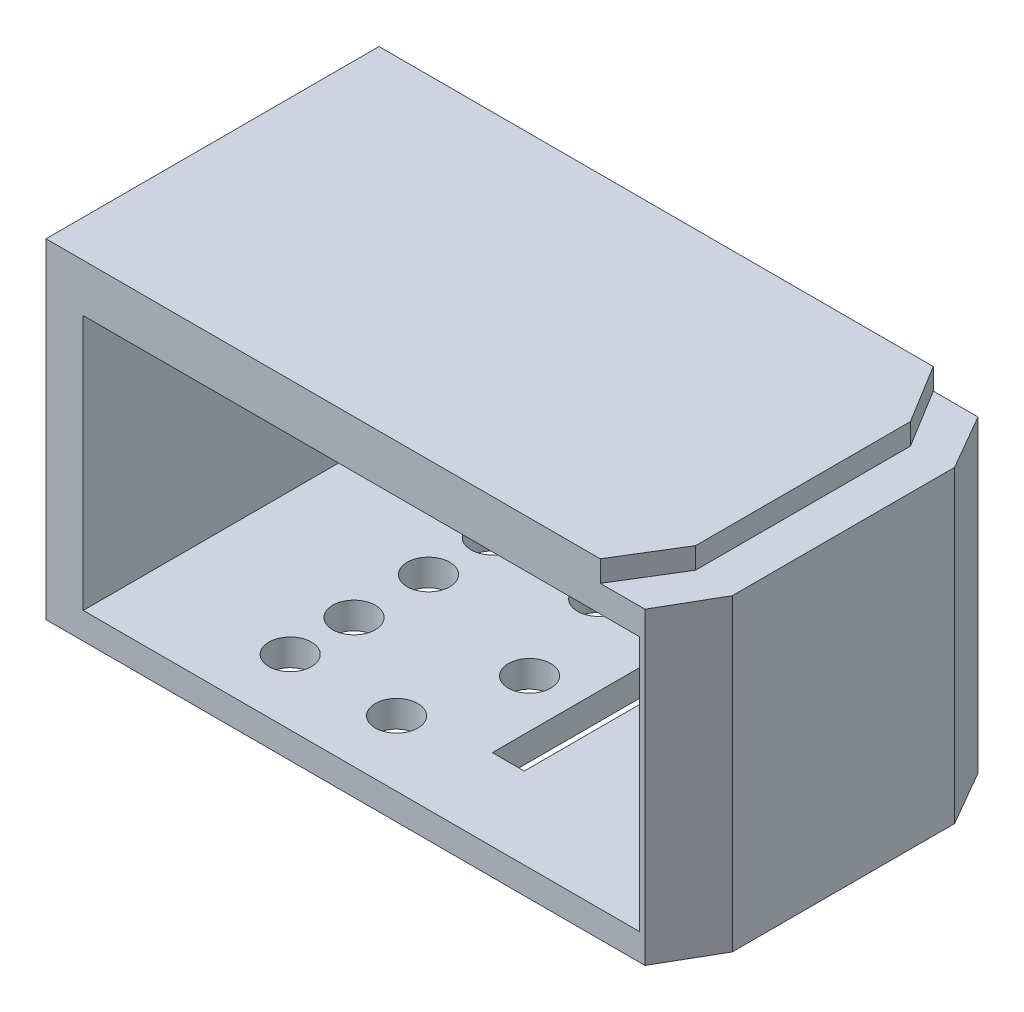
ISO-10303-21;
HEADER;
FILE_DESCRIPTION(('STEP AP214'),'2;1');
FILE_NAME('part.step','',(''),(''),'','','');
FILE_SCHEMA(('AUTOMOTIVE_DESIGN { 1 0 10303 214 1 1 1 1 }'));
ENDSEC;
DATA;
#1=APPLICATION_CONTEXT('core data for automotive mechanical design processes');
#2=APPLICATION_PROTOCOL_DEFINITION('international standard','automotive_design',2000,#1);
#3=PRODUCT_CONTEXT('',#1,'mechanical');
#4=PRODUCT('Part','Part','',(#3));
#5=PRODUCT_RELATED_PRODUCT_CATEGORY('part','',(#4));
#6=PRODUCT_DEFINITION_FORMATION('','',#4);
#7=PRODUCT_DEFINITION_CONTEXT('part definition',#1,'design');
#8=PRODUCT_DEFINITION('design','',#6,#7);
#9=PRODUCT_DEFINITION_SHAPE('','',#8);
#10=(LENGTH_UNIT() NAMED_UNIT(*) SI_UNIT(.MILLI.,.METRE.));
#11=(NAMED_UNIT(*) PLANE_ANGLE_UNIT() SI_UNIT($,.RADIAN.));
#12=(NAMED_UNIT(*) SI_UNIT($,.STERADIAN.) SOLID_ANGLE_UNIT());
#13=UNCERTAINTY_MEASURE_WITH_UNIT(LENGTH_MEASURE(1.E-05),#10,'distance_accuracy_value','');
#14=(GEOMETRIC_REPRESENTATION_CONTEXT(3) GLOBAL_UNCERTAINTY_ASSIGNED_CONTEXT((#13)) GLOBAL_UNIT_ASSIGNED_CONTEXT((#10,
#11,#12)) REPRESENTATION_CONTEXT('',''));
#15=CARTESIAN_POINT('',(0.,0.,0.));
#16=DIRECTION('',(0.,0.,1.));
#17=DIRECTION('',(1.,0.,0.));
#18=AXIS2_PLACEMENT_3D('',#15,#16,#17);
#19=CARTESIAN_POINT('',(-29.65,14.5,15.65));
#20=DIRECTION('',(0.,-1.,0.));
#21=DIRECTION('',(0.,0.,-1.));
#22=AXIS2_PLACEMENT_3D('',#19,#20,#21);
#23=PLANE('',#22);
#24=DIRECTION('',(0.523092608382002,0.,-0.852275849156899));
#25=VECTOR('',#24,1.);
#26=CARTESIAN_POINT('',(25.849999999997,14.5,10.100000000012));
#27=LINE('',#26,#25);
#28=CARTESIAN_POINT('',(22.4436334117782,14.5,15.65));
#29=VERTEX_POINT('',#28);
#30=CARTESIAN_POINT('',(25.849999999997,14.5,10.100000000012));
#31=VERTEX_POINT('',#30);
#32=EDGE_CURVE('E187',#29,#31,#27,.T.);
#33=ORIENTED_EDGE('',*,*,#32,.F.);
#34=DIRECTION('',(-1.,0.,0.));
#35=VECTOR('',#34,1.);
#36=CARTESIAN_POINT('',(-29.65,14.5,15.65));
#37=LINE('',#36,#35);
#38=CARTESIAN_POINT('',(26.6477786002139,14.5,15.65));
#39=VERTEX_POINT('',#38);
#40=EDGE_CURVE('E318',#39,#29,#37,.T.);
#41=ORIENTED_EDGE('',*,*,#40,.F.);
#42=DIRECTION('',(-0.500000000000003,0.,0.866025403784437));
#43=VECTOR('',#42,1.);
#44=CARTESIAN_POINT('',(26.6477786002139,14.5,15.65));
#45=LINE('',#44,#43);
#46=CARTESIAN_POINT('',(29.65,14.5,10.45));
#47=VERTEX_POINT('',#46);
#48=EDGE_CURVE('E269',#47,#39,#45,.T.);
#49=ORIENTED_EDGE('',*,*,#48,.F.);
#50=DIRECTION('',(0.,0.,-1.));
#51=VECTOR('',#50,1.);
#52=CARTESIAN_POINT('',(29.65,14.5,15.65));
#53=LINE('',#52,#51);
#54=CARTESIAN_POINT('',(29.65,14.5,-10.45));
#55=VERTEX_POINT('',#54);
#56=EDGE_CURVE('E338',#47,#55,#53,.T.);
#57=ORIENTED_EDGE('',*,*,#56,.T.);
#58=DIRECTION('',(0.500000000000004,0.,0.866025403784437));
#59=VECTOR('',#58,1.);
#60=CARTESIAN_POINT('',(26.6477786002139,14.5,-15.65));
#61=LINE('',#60,#59);
#62=CARTESIAN_POINT('',(26.6477786002139,14.5,-15.65));
#63=VERTEX_POINT('',#62);
#64=EDGE_CURVE('E281',#63,#55,#61,.T.);
#65=ORIENTED_EDGE('',*,*,#64,.F.);
#66=DIRECTION('',(-1.,0.,0.));
#67=VECTOR('',#66,1.);
#68=CARTESIAN_POINT('',(-29.65,14.5,-15.65));
#69=LINE('',#68,#67);
#70=CARTESIAN_POINT('',(22.4436334117781,14.5,-15.65));
#71=VERTEX_POINT('',#70);
#72=EDGE_CURVE('E55',#63,#71,#69,.T.);
#73=ORIENTED_EDGE('',*,*,#72,.T.);
#74=DIRECTION('',(-0.523092608380371,0.,-0.852275849157901));
#75=VECTOR('',#74,1.);
#76=CARTESIAN_POINT('',(22.4436334117781,14.5,-15.65));
#77=LINE('',#76,#75);
#78=CARTESIAN_POINT('',(25.8499999999969,14.5,-10.0999999999881));
#79=VERTEX_POINT('',#78);
#80=EDGE_CURVE('E196',#79,#71,#77,.T.);
#81=ORIENTED_EDGE('',*,*,#80,.F.);
#82=DIRECTION('',(0.,0.,-1.));
#83=VECTOR('',#82,1.);
#84=CARTESIAN_POINT('',(25.8499999999969,14.5,-10.0999999999881));
#85=LINE('',#84,#83);
#86=EDGE_CURVE('E49',#31,#79,#85,.T.);
#87=ORIENTED_EDGE('',*,*,#86,.F.);
#88=EDGE_LOOP('',(#33,#41,#49,#57,#65,#73,#81,#87));
#89=FACE_BOUND('',#88,.T.);
#90=ADVANCED_FACE('F34',(#89),#23,.F.);
#91=CARTESIAN_POINT('',(0.,0.,15.65));
#92=DIRECTION('',(0.,0.,1.));
#93=DIRECTION('',(1.,0.,0.));
#94=AXIS2_PLACEMENT_3D('',#91,#92,#93);
#95=PLANE('',#94);
#96=DIRECTION('',(0.,1.,0.));
#97=VECTOR('',#96,1.);
#98=CARTESIAN_POINT('',(26.6477786002139,-14.5,15.65));
#99=LINE('',#98,#97);
#100=CARTESIAN_POINT('',(26.6477786002139,-14.5,15.65));
#101=VERTEX_POINT('',#100);
#102=EDGE_CURVE('E272',#101,#39,#99,.T.);
#103=ORIENTED_EDGE('',*,*,#102,.T.);
#104=ORIENTED_EDGE('',*,*,#40,.T.);
#105=DIRECTION('',(0.,-1.,0.));
#106=VECTOR('',#105,1.);
#107=CARTESIAN_POINT('',(22.4436334117782,16.5,15.65));
#108=LINE('',#107,#106);
#109=CARTESIAN_POINT('',(22.4436334117782,16.5,15.65));
#110=VERTEX_POINT('',#109);
#111=EDGE_CURVE('E207',#110,#29,#108,.T.);
#112=ORIENTED_EDGE('',*,*,#111,.F.);
#113=DIRECTION('',(1.,0.,0.));
#114=VECTOR('',#113,1.);
#115=CARTESIAN_POINT('',(22.4436334117782,16.5,15.65));
#116=LINE('',#115,#114);
#117=CARTESIAN_POINT('',(-29.65,16.5,15.65));
#118=VERTEX_POINT('',#117);
#119=EDGE_CURVE('E206',#118,#110,#116,.T.);
#120=ORIENTED_EDGE('',*,*,#119,.F.);
#121=DIRECTION('',(0.,-1.,0.));
#122=VECTOR('',#121,1.);
#123=CARTESIAN_POINT('',(-29.65,14.5,15.65));
#124=LINE('',#123,#122);
#125=CARTESIAN_POINT('',(-29.65,-14.5,15.65));
#126=VERTEX_POINT('',#125);
#127=EDGE_CURVE('E321',#118,#126,#124,.T.);
#128=ORIENTED_EDGE('',*,*,#127,.T.);
#129=DIRECTION('',(1.,0.,0.));
#130=VECTOR('',#129,1.);
#131=CARTESIAN_POINT('',(-29.65,-14.5,15.65));
#132=LINE('',#131,#130);
#133=EDGE_CURVE('E324',#126,#101,#132,.T.);
#134=ORIENTED_EDGE('',*,*,#133,.T.);
#135=EDGE_LOOP('',(#103,#104,#112,#120,#128,#134));
#136=FACE_BOUND('',#135,.T.);
#137=DIRECTION('',(-1.,0.,0.));
#138=VECTOR('',#137,1.);
#139=CARTESIAN_POINT('',(-26.15,12.,15.65));
#140=LINE('',#139,#138);
#141=CARTESIAN_POINT('',(26.15,12.,15.65));
#142=VERTEX_POINT('',#141);
#143=CARTESIAN_POINT('',(-26.15,12.,15.65));
#144=VERTEX_POINT('',#143);
#145=EDGE_CURVE('E290',#142,#144,#140,.T.);
#146=ORIENTED_EDGE('',*,*,#145,.F.);
#147=DIRECTION('',(0.,1.,0.));
#148=VECTOR('',#147,1.);
#149=CARTESIAN_POINT('',(26.15,12.,15.65));
#150=LINE('',#149,#148);
#151=CARTESIAN_POINT('',(26.15,-12.,15.65));
#152=VERTEX_POINT('',#151);
#153=EDGE_CURVE('E288',#152,#142,#150,.T.);
#154=ORIENTED_EDGE('',*,*,#153,.F.);
#155=DIRECTION('',(1.,0.,0.));
#156=VECTOR('',#155,1.);
#157=CARTESIAN_POINT('',(-26.15,-12.,15.65));
#158=LINE('',#157,#156);
#159=CARTESIAN_POINT('',(-26.15,-12.,15.65));
#160=VERTEX_POINT('',#159);
#161=EDGE_CURVE('E296',#160,#152,#158,.T.);
#162=ORIENTED_EDGE('',*,*,#161,.F.);
#163=DIRECTION('',(0.,-1.,0.));
#164=VECTOR('',#163,1.);
#165=CARTESIAN_POINT('',(-26.15,12.,15.65));
#166=LINE('',#165,#164);
#167=EDGE_CURVE('E293',#144,#160,#166,.T.);
#168=ORIENTED_EDGE('',*,*,#167,.F.);
#169=EDGE_LOOP('',(#146,#154,#162,#168));
#170=FACE_BOUND('',#169,.T.);
#171=ADVANCED_FACE('F403',(#136,#170),#95,.T.);
#172=CARTESIAN_POINT('',(0.,0.,-15.65));
#173=DIRECTION('',(0.,0.,1.));
#174=DIRECTION('',(1.,0.,0.));
#175=AXIS2_PLACEMENT_3D('',#172,#173,#174);
#176=PLANE('',#175);
#177=ORIENTED_EDGE('',*,*,#72,.F.);
#178=DIRECTION('',(0.,1.,0.));
#179=VECTOR('',#178,1.);
#180=CARTESIAN_POINT('',(26.6477786002139,-14.5,-15.65));
#181=LINE('',#180,#179);
#182=CARTESIAN_POINT('',(26.6477786002139,-14.5,-15.65));
#183=VERTEX_POINT('',#182);
#184=EDGE_CURVE('E280',#183,#63,#181,.T.);
#185=ORIENTED_EDGE('',*,*,#184,.F.);
#186=DIRECTION('',(1.,0.,0.));
#187=VECTOR('',#186,1.);
#188=CARTESIAN_POINT('',(-29.65,-14.5,-15.65));
#189=LINE('',#188,#187);
#190=CARTESIAN_POINT('',(-29.65,-14.5,-15.65));
#191=VERTEX_POINT('',#190);
#192=EDGE_CURVE('E322',#191,#183,#189,.T.);
#193=ORIENTED_EDGE('',*,*,#192,.F.);
#194=DIRECTION('',(0.,-1.,0.));
#195=VECTOR('',#194,1.);
#196=CARTESIAN_POINT('',(-29.65,14.5,-15.65));
#197=LINE('',#196,#195);
#198=CARTESIAN_POINT('',(-29.65,16.5,-15.65));
#199=VERTEX_POINT('',#198);
#200=EDGE_CURVE('E329',#199,#191,#197,.T.);
#201=ORIENTED_EDGE('',*,*,#200,.F.);
#202=DIRECTION('',(-1.,0.,0.));
#203=VECTOR('',#202,1.);
#204=CARTESIAN_POINT('',(-29.65,16.5,-15.65));
#205=LINE('',#204,#203);
#206=CARTESIAN_POINT('',(22.4436334117781,16.5,-15.65));
#207=VERTEX_POINT('',#206);
#208=EDGE_CURVE('E200',#207,#199,#205,.T.);
#209=ORIENTED_EDGE('',*,*,#208,.F.);
#210=DIRECTION('',(0.,-1.,0.));
#211=VECTOR('',#210,1.);
#212=CARTESIAN_POINT('',(22.4436334117781,16.5,-15.65));
#213=LINE('',#212,#211);
#214=EDGE_CURVE('E213',#207,#71,#213,.T.);
#215=ORIENTED_EDGE('',*,*,#214,.T.);
#216=EDGE_LOOP('',(#177,#185,#193,#201,#209,#215));
#217=FACE_BOUND('',#216,.T.);
#218=DIRECTION('',(0.,1.,0.));
#219=VECTOR('',#218,1.);
#220=CARTESIAN_POINT('',(26.15,12.,-15.65));
#221=LINE('',#220,#219);
#222=CARTESIAN_POINT('',(26.15,-12.,-15.65));
#223=VERTEX_POINT('',#222);
#224=CARTESIAN_POINT('',(26.15,12.,-15.65));
#225=VERTEX_POINT('',#224);
#226=EDGE_CURVE('E179',#223,#225,#221,.T.);
#227=ORIENTED_EDGE('',*,*,#226,.T.);
#228=DIRECTION('',(-1.,0.,0.));
#229=VECTOR('',#228,1.);
#230=CARTESIAN_POINT('',(-26.15,12.,-15.65));
#231=LINE('',#230,#229);
#232=CARTESIAN_POINT('',(-26.15,12.,-15.65));
#233=VERTEX_POINT('',#232);
#234=EDGE_CURVE('E301',#225,#233,#231,.T.);
#235=ORIENTED_EDGE('',*,*,#234,.T.);
#236=DIRECTION('',(0.,-1.,0.));
#237=VECTOR('',#236,1.);
#238=CARTESIAN_POINT('',(-26.15,12.,-15.65));
#239=LINE('',#238,#237);
#240=CARTESIAN_POINT('',(-26.15,-12.,-15.65));
#241=VERTEX_POINT('',#240);
#242=EDGE_CURVE('E304',#233,#241,#239,.T.);
#243=ORIENTED_EDGE('',*,*,#242,.T.);
#244=DIRECTION('',(1.,0.,0.));
#245=VECTOR('',#244,1.);
#246=CARTESIAN_POINT('',(-26.15,-12.,-15.65));
#247=LINE('',#246,#245);
#248=EDGE_CURVE('E291',#241,#223,#247,.T.);
#249=ORIENTED_EDGE('',*,*,#248,.T.);
#250=EDGE_LOOP('',(#227,#235,#243,#249));
#251=FACE_BOUND('',#250,.T.);
#252=ADVANCED_FACE('F407',(#217,#251),#176,.F.);
#253=CARTESIAN_POINT('',(29.65,14.5,15.65));
#254=DIRECTION('',(-1.,0.,0.));
#255=DIRECTION('',(0.,0.,1.));
#256=AXIS2_PLACEMENT_3D('',#253,#254,#255);
#257=PLANE('',#256);
#258=ORIENTED_EDGE('',*,*,#56,.F.);
#259=DIRECTION('',(0.,1.,0.));
#260=VECTOR('',#259,1.);
#261=CARTESIAN_POINT('',(29.65,-14.5,10.45));
#262=LINE('',#261,#260);
#263=CARTESIAN_POINT('',(29.65,-14.5,10.45));
#264=VERTEX_POINT('',#263);
#265=EDGE_CURVE('E268',#264,#47,#262,.T.);
#266=ORIENTED_EDGE('',*,*,#265,.F.);
#267=DIRECTION('',(0.,0.,-1.));
#268=VECTOR('',#267,1.);
#269=CARTESIAN_POINT('',(29.65,-14.5,15.65));
#270=LINE('',#269,#268);
#271=CARTESIAN_POINT('',(29.65,-14.5,-10.4499999999999));
#272=VERTEX_POINT('',#271);
#273=EDGE_CURVE('E327',#264,#272,#270,.T.);
#274=ORIENTED_EDGE('',*,*,#273,.T.);
#275=DIRECTION('',(0.,1.,0.));
#276=VECTOR('',#275,1.);
#277=CARTESIAN_POINT('',(29.65,-14.5,-10.45));
#278=LINE('',#277,#276);
#279=EDGE_CURVE('E271',#272,#55,#278,.T.);
#280=ORIENTED_EDGE('',*,*,#279,.T.);
#281=EDGE_LOOP('',(#258,#266,#274,#280));
#282=FACE_BOUND('',#281,.T.);
#283=ADVANCED_FACE('F36',(#282),#257,.F.);
#284=CARTESIAN_POINT('',(-29.65,14.5,15.65));
#285=DIRECTION('',(1.,0.,0.));
#286=DIRECTION('',(0.,0.,-1.));
#287=AXIS2_PLACEMENT_3D('',#284,#285,#286);
#288=PLANE('',#287);
#289=DIRECTION('',(0.,0.,-1.));
#290=VECTOR('',#289,1.);
#291=CARTESIAN_POINT('',(-29.65,15.,15.65));
#292=LINE('',#291,#290);
#293=CARTESIAN_POINT('',(-29.65,15.,2.30000000000001));
#294=VERTEX_POINT('',#293);
#295=CARTESIAN_POINT('',(-29.65,15.,-2.29999999999999));
#296=VERTEX_POINT('',#295);
#297=EDGE_CURVE('E11',#294,#296,#292,.T.);
#298=ORIENTED_EDGE('',*,*,#297,.F.);
#299=DIRECTION('',(0.,1.,0.));
#300=VECTOR('',#299,1.);
#301=CARTESIAN_POINT('',(-29.65,-14.5,2.30000000000001));
#302=LINE('',#301,#300);
#303=CARTESIAN_POINT('',(-29.65,-14.5,2.30000000000001));
#304=VERTEX_POINT('',#303);
#305=EDGE_CURVE('E180',#294,#304,#302,.F.);
#306=ORIENTED_EDGE('',*,*,#305,.T.);
#307=DIRECTION('',(0.,0.,-1.));
#308=VECTOR('',#307,1.);
#309=CARTESIAN_POINT('',(-29.65,-14.5,15.65));
#310=LINE('',#309,#308);
#311=EDGE_CURVE('E335',#126,#304,#310,.T.);
#312=ORIENTED_EDGE('',*,*,#311,.F.);
#313=ORIENTED_EDGE('',*,*,#127,.F.);
#314=DIRECTION('',(0.,0.,1.));
#315=VECTOR('',#314,1.);
#316=CARTESIAN_POINT('',(-29.65,16.5,-15.65));
#317=LINE('',#316,#315);
#318=EDGE_CURVE('E203',#199,#118,#317,.T.);
#319=ORIENTED_EDGE('',*,*,#318,.F.);
#320=ORIENTED_EDGE('',*,*,#200,.T.);
#321=CARTESIAN_POINT('',(-29.65,-14.5,-2.29999999999999));
#322=VERTEX_POINT('',#321);
#323=EDGE_CURVE('E175',#322,#191,#310,.T.);
#324=ORIENTED_EDGE('',*,*,#323,.F.);
#325=DIRECTION('',(0.,1.,0.));
#326=VECTOR('',#325,1.);
#327=CARTESIAN_POINT('',(-29.65,-14.5,-2.29999999999999));
#328=LINE('',#327,#326);
#329=EDGE_CURVE('E171',#322,#296,#328,.T.);
#330=ORIENTED_EDGE('',*,*,#329,.T.);
#331=EDGE_LOOP('',(#298,#306,#312,#313,#319,#320,#324,#330));
#332=FACE_BOUND('',#331,.T.);
#333=ADVANCED_FACE('F172',(#332),#288,.F.);
#334=CARTESIAN_POINT('',(-29.65,-14.5,15.65));
#335=DIRECTION('',(0.,1.,0.));
#336=DIRECTION('',(0.,0.,1.));
#337=AXIS2_PLACEMENT_3D('',#334,#335,#336);
#338=PLANE('',#337);
#339=DIRECTION('',(-1.,0.,0.));
#340=VECTOR('',#339,1.);
#341=CARTESIAN_POINT('',(4.65,-14.5,8.));
#342=LINE('',#341,#340);
#343=CARTESIAN_POINT('',(7.64999999999999,-14.5,8.));
#344=VERTEX_POINT('',#343);
#345=CARTESIAN_POINT('',(4.65,-14.5,8.));
#346=VERTEX_POINT('',#345);
#347=EDGE_CURVE('E230',#344,#346,#342,.T.);
#348=ORIENTED_EDGE('',*,*,#347,.F.);
#349=DIRECTION('',(0.,0.,1.));
#350=VECTOR('',#349,1.);
#351=CARTESIAN_POINT('',(7.65,-14.5,8.));
#352=LINE('',#351,#350);
#353=CARTESIAN_POINT('',(7.65,-14.5,-8.));
#354=VERTEX_POINT('',#353);
#355=EDGE_CURVE('E228',#354,#344,#352,.T.);
#356=ORIENTED_EDGE('',*,*,#355,.F.);
#357=DIRECTION('',(1.,0.,0.));
#358=VECTOR('',#357,1.);
#359=CARTESIAN_POINT('',(4.65,-14.5,-8.));
#360=LINE('',#359,#358);
#361=CARTESIAN_POINT('',(4.65,-14.5,-8.));
#362=VERTEX_POINT('',#361);
#363=EDGE_CURVE('E236',#362,#354,#360,.T.);
#364=ORIENTED_EDGE('',*,*,#363,.F.);
#365=DIRECTION('',(0.,0.,-1.));
#366=VECTOR('',#365,1.);
#367=CARTESIAN_POINT('',(4.65,-14.5,8.));
#368=LINE('',#367,#366);
#369=EDGE_CURVE('E233',#346,#362,#368,.T.);
#370=ORIENTED_EDGE('',*,*,#369,.F.);
#371=EDGE_LOOP('',(#348,#356,#364,#370));
#372=FACE_BOUND('',#371,.T.);
#373=CARTESIAN_POINT('',(-12.85,-14.5,-3.5));
#374=DIRECTION('',(0.,-1.,0.));
#375=DIRECTION('',(0.,0.,1.));
#376=AXIS2_PLACEMENT_3D('',#373,#374,#375);
#377=CIRCLE('',#376,2.);
#378=CARTESIAN_POINT('',(-12.85,-14.5,-1.5));
#379=VERTEX_POINT('',#378);
#380=EDGE_CURVE('E225',#379,#379,#377,.T.);
#381=ORIENTED_EDGE('',*,*,#380,.F.);
#382=EDGE_LOOP('',(#381));
#383=FACE_BOUND('',#382,.T.);
#384=CARTESIAN_POINT('',(-12.85,-14.5,-9.5));
#385=DIRECTION('',(0.,-1.,0.));
#386=DIRECTION('',(0.,0.,1.));
#387=AXIS2_PLACEMENT_3D('',#384,#385,#386);
#388=CIRCLE('',#387,2.);
#389=CARTESIAN_POINT('',(-12.85,-14.5,-7.5));
#390=VERTEX_POINT('',#389);
#391=EDGE_CURVE('E222',#390,#390,#388,.T.);
#392=ORIENTED_EDGE('',*,*,#391,.F.);
#393=EDGE_LOOP('',(#392));
#394=FACE_BOUND('',#393,.T.);
#395=CARTESIAN_POINT('',(-2.85,-14.5,-9.5));
#396=DIRECTION('',(0.,-1.,0.));
#397=DIRECTION('',(0.,0.,1.));
#398=AXIS2_PLACEMENT_3D('',#395,#396,#397);
#399=CIRCLE('',#398,2.);
#400=CARTESIAN_POINT('',(-2.85,-14.5,-7.5));
#401=VERTEX_POINT('',#400);
#402=EDGE_CURVE('E221',#401,#401,#399,.T.);
#403=ORIENTED_EDGE('',*,*,#402,.F.);
#404=EDGE_LOOP('',(#403));
#405=FACE_BOUND('',#404,.T.);
#406=CARTESIAN_POINT('',(-12.85,-14.5,3.5));
#407=DIRECTION('',(0.,-1.,0.));
#408=DIRECTION('',(0.,0.,-1.));
#409=AXIS2_PLACEMENT_3D('',#406,#407,#408);
#410=CIRCLE('',#409,2.);
#411=CARTESIAN_POINT('',(-12.85,-14.5,1.5));
#412=VERTEX_POINT('',#411);
#413=EDGE_CURVE('E242',#412,#412,#410,.T.);
#414=ORIENTED_EDGE('',*,*,#413,.F.);
#415=EDGE_LOOP('',(#414));
#416=FACE_BOUND('',#415,.T.);
#417=CARTESIAN_POINT('',(-12.85,-14.5,9.5));
#418=DIRECTION('',(0.,-1.,0.));
#419=DIRECTION('',(0.,0.,-1.));
#420=AXIS2_PLACEMENT_3D('',#417,#418,#419);
#421=CIRCLE('',#420,2.);
#422=CARTESIAN_POINT('',(-12.85,-14.5,7.5));
#423=VERTEX_POINT('',#422);
#424=EDGE_CURVE('E255',#423,#423,#421,.T.);
#425=ORIENTED_EDGE('',*,*,#424,.F.);
#426=EDGE_LOOP('',(#425));
#427=FACE_BOUND('',#426,.T.);
#428=CARTESIAN_POINT('',(-2.85,-14.5,9.5));
#429=DIRECTION('',(0.,-1.,0.));
#430=DIRECTION('',(0.,0.,-1.));
#431=AXIS2_PLACEMENT_3D('',#428,#429,#430);
#432=CIRCLE('',#431,2.);
#433=CARTESIAN_POINT('',(-2.85,-14.5,7.5));
#434=VERTEX_POINT('',#433);
#435=EDGE_CURVE('E251',#434,#434,#432,.T.);
#436=ORIENTED_EDGE('',*,*,#435,.F.);
#437=EDGE_LOOP('',(#436));
#438=FACE_BOUND('',#437,.T.);
#439=CARTESIAN_POINT('',(0.149999999999997,-14.5,0.));
#440=DIRECTION('',(0.,-1.,0.));
#441=DIRECTION('',(0.,0.,-1.));
#442=AXIS2_PLACEMENT_3D('',#439,#440,#441);
#443=CIRCLE('',#442,2.);
#444=CARTESIAN_POINT('',(0.149999999999997,-14.5,-2.));
#445=VERTEX_POINT('',#444);
#446=EDGE_CURVE('E260',#445,#445,#443,.T.);
#447=ORIENTED_EDGE('',*,*,#446,.F.);
#448=EDGE_LOOP('',(#447));
#449=FACE_BOUND('',#448,.T.);
#450=ORIENTED_EDGE('',*,*,#273,.F.);
#451=DIRECTION('',(-0.500000000000003,0.,0.866025403784437));
#452=VECTOR('',#451,1.);
#453=CARTESIAN_POINT('',(26.6477786002139,-14.5,15.65));
#454=LINE('',#453,#452);
#455=EDGE_CURVE('E265',#264,#101,#454,.T.);
#456=ORIENTED_EDGE('',*,*,#455,.T.);
#457=ORIENTED_EDGE('',*,*,#133,.F.);
#458=ORIENTED_EDGE('',*,*,#311,.T.);
#459=CARTESIAN_POINT('',(-29.65,-14.5,0.));
#460=DIRECTION('',(0.,1.,0.));
#461=DIRECTION('',(-1.,0.,0.));
#462=AXIS2_PLACEMENT_3D('',#459,#460,#461);
#463=CIRCLE('',#462,2.3);
#464=EDGE_CURVE('E275',#304,#322,#463,.T.);
#465=ORIENTED_EDGE('',*,*,#464,.T.);
#466=ORIENTED_EDGE('',*,*,#323,.T.);
#467=ORIENTED_EDGE('',*,*,#192,.T.);
#468=DIRECTION('',(0.500000000000004,0.,0.866025403784437));
#469=VECTOR('',#468,1.);
#470=CARTESIAN_POINT('',(26.6477786002139,-14.5,-15.65));
#471=LINE('',#470,#469);
#472=EDGE_CURVE('E277',#183,#272,#471,.T.);
#473=ORIENTED_EDGE('',*,*,#472,.T.);
#474=EDGE_LOOP('',(#450,#456,#457,#458,#465,#466,#467,#473));
#475=FACE_BOUND('',#474,.T.);
#476=ADVANCED_FACE('F386',(#372,#383,#394,#405,#416,#427,#438,#449,#475),#338,.F.);
#477=CARTESIAN_POINT('',(26.15,12.,15.65));
#478=DIRECTION('',(-1.,0.,0.));
#479=DIRECTION('',(0.,-1.,0.));
#480=AXIS2_PLACEMENT_3D('',#477,#478,#479);
#481=PLANE('',#480);
#482=ORIENTED_EDGE('',*,*,#226,.F.);
#483=DIRECTION('',(0.,0.,-1.));
#484=VECTOR('',#483,1.);
#485=CARTESIAN_POINT('',(26.15,-12.,15.65));
#486=LINE('',#485,#484);
#487=EDGE_CURVE('E298',#152,#223,#486,.T.);
#488=ORIENTED_EDGE('',*,*,#487,.F.);
#489=ORIENTED_EDGE('',*,*,#153,.T.);
#490=DIRECTION('',(0.,0.,-1.));
#491=VECTOR('',#490,1.);
#492=CARTESIAN_POINT('',(26.15,12.,15.65));
#493=LINE('',#492,#491);
#494=EDGE_CURVE('E315',#142,#225,#493,.T.);
#495=ORIENTED_EDGE('',*,*,#494,.T.);
#496=EDGE_LOOP('',(#482,#488,#489,#495));
#497=FACE_BOUND('',#496,.T.);
#498=ADVANCED_FACE('F415',(#497),#481,.T.);
#499=CARTESIAN_POINT('',(-26.15,12.,15.65));
#500=DIRECTION('',(0.,-1.,0.));
#501=DIRECTION('',(0.,0.,-1.));
#502=AXIS2_PLACEMENT_3D('',#499,#500,#501);
#503=PLANE('',#502);
#504=ORIENTED_EDGE('',*,*,#234,.F.);
#505=ORIENTED_EDGE('',*,*,#494,.F.);
#506=ORIENTED_EDGE('',*,*,#145,.T.);
#507=DIRECTION('',(0.,0.,-1.));
#508=VECTOR('',#507,1.);
#509=CARTESIAN_POINT('',(-26.15,12.,15.65));
#510=LINE('',#509,#508);
#511=EDGE_CURVE('E313',#144,#233,#510,.T.);
#512=ORIENTED_EDGE('',*,*,#511,.T.);
#513=EDGE_LOOP('',(#504,#505,#506,#512));
#514=FACE_BOUND('',#513,.T.);
#515=ADVANCED_FACE('F421',(#514),#503,.T.);
#516=CARTESIAN_POINT('',(-26.15,12.,15.65));
#517=DIRECTION('',(1.,0.,0.));
#518=DIRECTION('',(0.,0.,-1.));
#519=AXIS2_PLACEMENT_3D('',#516,#517,#518);
#520=PLANE('',#519);
#521=ORIENTED_EDGE('',*,*,#242,.F.);
#522=ORIENTED_EDGE('',*,*,#511,.F.);
#523=ORIENTED_EDGE('',*,*,#167,.T.);
#524=DIRECTION('',(0.,0.,-1.));
#525=VECTOR('',#524,1.);
#526=CARTESIAN_POINT('',(-26.15,-12.,15.65));
#527=LINE('',#526,#525);
#528=EDGE_CURVE('E311',#160,#241,#527,.T.);
#529=ORIENTED_EDGE('',*,*,#528,.T.);
#530=EDGE_LOOP('',(#521,#522,#523,#529));
#531=FACE_BOUND('',#530,.T.);
#532=ADVANCED_FACE('F425',(#531),#520,.T.);
#533=CARTESIAN_POINT('',(-26.15,-12.,15.65));
#534=DIRECTION('',(0.,1.,0.));
#535=DIRECTION('',(0.,0.,1.));
#536=AXIS2_PLACEMENT_3D('',#533,#534,#535);
#537=PLANE('',#536);
#538=DIRECTION('',(0.,0.,-1.));
#539=VECTOR('',#538,1.);
#540=CARTESIAN_POINT('',(7.65,-12.,15.65));
#541=LINE('',#540,#539);
#542=CARTESIAN_POINT('',(7.65,-12.,8.));
#543=VERTEX_POINT('',#542);
#544=CARTESIAN_POINT('',(7.65,-12.,-8.));
#545=VERTEX_POINT('',#544);
#546=EDGE_CURVE('E42',#543,#545,#541,.T.);
#547=ORIENTED_EDGE('',*,*,#546,.F.);
#548=DIRECTION('',(1.,0.,0.));
#549=VECTOR('',#548,1.);
#550=CARTESIAN_POINT('',(-26.15,-12.,8.));
#551=LINE('',#550,#549);
#552=CARTESIAN_POINT('',(4.65,-12.,8.));
#553=VERTEX_POINT('',#552);
#554=EDGE_CURVE('E341',#553,#543,#551,.T.);
#555=ORIENTED_EDGE('',*,*,#554,.F.);
#556=DIRECTION('',(0.,0.,1.));
#557=VECTOR('',#556,1.);
#558=CARTESIAN_POINT('',(4.65,-12.,15.65));
#559=LINE('',#558,#557);
#560=CARTESIAN_POINT('',(4.65,-12.,-8.));
#561=VERTEX_POINT('',#560);
#562=EDGE_CURVE('E361',#561,#553,#559,.T.);
#563=ORIENTED_EDGE('',*,*,#562,.F.);
#564=DIRECTION('',(-1.,0.,0.));
#565=VECTOR('',#564,1.);
#566=CARTESIAN_POINT('',(-26.15,-12.,-8.));
#567=LINE('',#566,#565);
#568=EDGE_CURVE('E364',#545,#561,#567,.T.);
#569=ORIENTED_EDGE('',*,*,#568,.F.);
#570=EDGE_LOOP('',(#547,#555,#563,#569));
#571=FACE_BOUND('',#570,.T.);
#572=CARTESIAN_POINT('',(-12.85,-12.,-3.5));
#573=DIRECTION('',(0.,1.,0.));
#574=DIRECTION('',(0.,0.,1.));
#575=AXIS2_PLACEMENT_3D('',#572,#573,#574);
#576=CIRCLE('',#575,2.);
#577=CARTESIAN_POINT('',(-12.85,-12.,-1.5));
#578=VERTEX_POINT('',#577);
#579=EDGE_CURVE('E264',#578,#578,#576,.T.);
#580=ORIENTED_EDGE('',*,*,#579,.F.);
#581=EDGE_LOOP('',(#580));
#582=FACE_BOUND('',#581,.T.);
#583=CARTESIAN_POINT('',(-12.85,-12.,-9.5));
#584=DIRECTION('',(0.,1.,0.));
#585=DIRECTION('',(0.,0.,1.));
#586=AXIS2_PLACEMENT_3D('',#583,#584,#585);
#587=CIRCLE('',#586,2.);
#588=CARTESIAN_POINT('',(-12.85,-12.,-7.5));
#589=VERTEX_POINT('',#588);
#590=EDGE_CURVE('E355',#589,#589,#587,.T.);
#591=ORIENTED_EDGE('',*,*,#590,.F.);
#592=EDGE_LOOP('',(#591));
#593=FACE_BOUND('',#592,.T.);
#594=CARTESIAN_POINT('',(-2.85,-12.,-9.5));
#595=DIRECTION('',(0.,1.,0.));
#596=DIRECTION('',(0.,0.,1.));
#597=AXIS2_PLACEMENT_3D('',#594,#595,#596);
#598=CIRCLE('',#597,2.);
#599=CARTESIAN_POINT('',(-2.85,-12.,-7.5));
#600=VERTEX_POINT('',#599);
#601=EDGE_CURVE('E352',#600,#600,#598,.T.);
#602=ORIENTED_EDGE('',*,*,#601,.F.);
#603=EDGE_LOOP('',(#602));
#604=FACE_BOUND('',#603,.T.);
#605=CARTESIAN_POINT('',(-12.85,-12.,3.5));
#606=DIRECTION('',(0.,1.,0.));
#607=DIRECTION('',(0.,0.,1.));
#608=AXIS2_PLACEMENT_3D('',#605,#606,#607);
#609=CIRCLE('',#608,2.);
#610=CARTESIAN_POINT('',(-12.85,-12.,5.5));
#611=VERTEX_POINT('',#610);
#612=EDGE_CURVE('E349',#611,#611,#609,.T.);
#613=ORIENTED_EDGE('',*,*,#612,.F.);
#614=EDGE_LOOP('',(#613));
#615=FACE_BOUND('',#614,.T.);
#616=CARTESIAN_POINT('',(-12.85,-12.,9.5));
#617=DIRECTION('',(0.,1.,0.));
#618=DIRECTION('',(0.,0.,1.));
#619=AXIS2_PLACEMENT_3D('',#616,#617,#618);
#620=CIRCLE('',#619,2.);
#621=CARTESIAN_POINT('',(-12.85,-12.,11.5));
#622=VERTEX_POINT('',#621);
#623=EDGE_CURVE('E346',#622,#622,#620,.T.);
#624=ORIENTED_EDGE('',*,*,#623,.F.);
#625=EDGE_LOOP('',(#624));
#626=FACE_BOUND('',#625,.T.);
#627=CARTESIAN_POINT('',(-2.85,-12.,9.5));
#628=DIRECTION('',(0.,1.,0.));
#629=DIRECTION('',(0.,0.,1.));
#630=AXIS2_PLACEMENT_3D('',#627,#628,#629);
#631=CIRCLE('',#630,2.);
#632=CARTESIAN_POINT('',(-2.85,-12.,11.5));
#633=VERTEX_POINT('',#632);
#634=EDGE_CURVE('E254',#633,#633,#631,.T.);
#635=ORIENTED_EDGE('',*,*,#634,.F.);
#636=EDGE_LOOP('',(#635));
#637=FACE_BOUND('',#636,.T.);
#638=CARTESIAN_POINT('',(0.149999999999997,-12.,0.));
#639=DIRECTION('',(0.,1.,0.));
#640=DIRECTION('',(0.,0.,1.));
#641=AXIS2_PLACEMENT_3D('',#638,#639,#640);
#642=CIRCLE('',#641,2.);
#643=CARTESIAN_POINT('',(0.149999999999997,-12.,2.));
#644=VERTEX_POINT('',#643);
#645=EDGE_CURVE('E263',#644,#644,#642,.T.);
#646=ORIENTED_EDGE('',*,*,#645,.F.);
#647=EDGE_LOOP('',(#646));
#648=FACE_BOUND('',#647,.T.);
#649=ORIENTED_EDGE('',*,*,#248,.F.);
#650=ORIENTED_EDGE('',*,*,#528,.F.);
#651=ORIENTED_EDGE('',*,*,#161,.T.);
#652=ORIENTED_EDGE('',*,*,#487,.T.);
#653=EDGE_LOOP('',(#649,#650,#651,#652));
#654=FACE_BOUND('',#653,.T.);
#655=ADVANCED_FACE('F379',(#571,#582,#593,#604,#615,#626,#637,#648,#654),#537,.T.);
#656=CARTESIAN_POINT('',(-29.65,-14.5,0.));
#657=DIRECTION('',(0.,1.,0.));
#658=DIRECTION('',(-1.,0.,0.));
#659=AXIS2_PLACEMENT_3D('',#656,#657,#658);
#660=CYLINDRICAL_SURFACE('',#659,2.3);
#661=ORIENTED_EDGE('',*,*,#464,.F.);
#662=ORIENTED_EDGE('',*,*,#305,.F.);
#663=CARTESIAN_POINT('',(-29.65,15.,0.));
#664=DIRECTION('',(0.,-1.,0.));
#665=DIRECTION('',(0.,0.,-1.));
#666=AXIS2_PLACEMENT_3D('',#663,#664,#665);
#667=CIRCLE('',#666,2.3);
#668=EDGE_CURVE('E185',#296,#294,#667,.T.);
#669=ORIENTED_EDGE('',*,*,#668,.F.);
#670=ORIENTED_EDGE('',*,*,#329,.F.);
#671=EDGE_LOOP('',(#661,#662,#669,#670));
#672=FACE_BOUND('',#671,.T.);
#673=ADVANCED_FACE('F186',(#672),#660,.F.);
#674=CARTESIAN_POINT('',(26.6477786002139,-14.5,-15.65));
#675=DIRECTION('',(-0.866025403784437,0.,0.500000000000004));
#676=DIRECTION('',(0.500000000000004,0.,0.866025403784437));
#677=AXIS2_PLACEMENT_3D('',#674,#675,#676);
#678=PLANE('',#677);
#679=ORIENTED_EDGE('',*,*,#64,.T.);
#680=ORIENTED_EDGE('',*,*,#279,.F.);
#681=ORIENTED_EDGE('',*,*,#472,.F.);
#682=ORIENTED_EDGE('',*,*,#184,.T.);
#683=EDGE_LOOP('',(#679,#680,#681,#682));
#684=FACE_BOUND('',#683,.T.);
#685=ADVANCED_FACE('F434',(#684),#678,.F.);
#686=CARTESIAN_POINT('',(26.6477786002139,-14.5,15.65));
#687=DIRECTION('',(-0.866025403784437,0.,-0.500000000000003));
#688=DIRECTION('',(-0.500000000000003,0.,0.866025403784437));
#689=AXIS2_PLACEMENT_3D('',#686,#687,#688);
#690=PLANE('',#689);
#691=ORIENTED_EDGE('',*,*,#48,.T.);
#692=ORIENTED_EDGE('',*,*,#102,.F.);
#693=ORIENTED_EDGE('',*,*,#455,.F.);
#694=ORIENTED_EDGE('',*,*,#265,.T.);
#695=EDGE_LOOP('',(#691,#692,#693,#694));
#696=FACE_BOUND('',#695,.T.);
#697=ADVANCED_FACE('F437',(#696),#690,.F.);
#698=CARTESIAN_POINT('',(0.149999999999997,-10.9,0.));
#699=DIRECTION('',(0.,-1.,0.));
#700=DIRECTION('',(0.,0.,-1.));
#701=AXIS2_PLACEMENT_3D('',#698,#699,#700);
#702=CYLINDRICAL_SURFACE('',#701,2.);
#703=ORIENTED_EDGE('',*,*,#645,.T.);
#704=EDGE_LOOP('',(#703));
#705=FACE_BOUND('',#704,.T.);
#706=ORIENTED_EDGE('',*,*,#446,.T.);
#707=EDGE_LOOP('',(#706));
#708=FACE_BOUND('',#707,.T.);
#709=ADVANCED_FACE('F441',(#705,#708),#702,.F.);
#710=CARTESIAN_POINT('',(-2.85,-10.9,9.5));
#711=DIRECTION('',(0.,-1.,0.));
#712=DIRECTION('',(0.,0.,-1.));
#713=AXIS2_PLACEMENT_3D('',#710,#711,#712);
#714=CYLINDRICAL_SURFACE('',#713,2.);
#715=ORIENTED_EDGE('',*,*,#634,.T.);
#716=EDGE_LOOP('',(#715));
#717=FACE_BOUND('',#716,.T.);
#718=ORIENTED_EDGE('',*,*,#435,.T.);
#719=EDGE_LOOP('',(#718));
#720=FACE_BOUND('',#719,.T.);
#721=ADVANCED_FACE('F445',(#717,#720),#714,.F.);
#722=CARTESIAN_POINT('',(-12.85,-10.9,9.5));
#723=DIRECTION('',(0.,-1.,0.));
#724=DIRECTION('',(0.,0.,-1.));
#725=AXIS2_PLACEMENT_3D('',#722,#723,#724);
#726=CYLINDRICAL_SURFACE('',#725,2.);
#727=ORIENTED_EDGE('',*,*,#623,.T.);
#728=EDGE_LOOP('',(#727));
#729=FACE_BOUND('',#728,.T.);
#730=ORIENTED_EDGE('',*,*,#424,.T.);
#731=EDGE_LOOP('',(#730));
#732=FACE_BOUND('',#731,.T.);
#733=ADVANCED_FACE('F451',(#729,#732),#726,.F.);
#734=CARTESIAN_POINT('',(-12.85,-10.9,3.5));
#735=DIRECTION('',(0.,-1.,0.));
#736=DIRECTION('',(0.,0.,-1.));
#737=AXIS2_PLACEMENT_3D('',#734,#735,#736);
#738=CYLINDRICAL_SURFACE('',#737,2.);
#739=ORIENTED_EDGE('',*,*,#612,.T.);
#740=EDGE_LOOP('',(#739));
#741=FACE_BOUND('',#740,.T.);
#742=ORIENTED_EDGE('',*,*,#413,.T.);
#743=EDGE_LOOP('',(#742));
#744=FACE_BOUND('',#743,.T.);
#745=ADVANCED_FACE('F447',(#741,#744),#738,.F.);
#746=CARTESIAN_POINT('',(-2.85,-10.9,-9.5));
#747=DIRECTION('',(0.,-1.,0.));
#748=DIRECTION('',(0.,0.,-1.));
#749=AXIS2_PLACEMENT_3D('',#746,#747,#748);
#750=CYLINDRICAL_SURFACE('',#749,2.);
#751=ORIENTED_EDGE('',*,*,#601,.T.);
#752=EDGE_LOOP('',(#751));
#753=FACE_BOUND('',#752,.T.);
#754=ORIENTED_EDGE('',*,*,#402,.T.);
#755=EDGE_LOOP('',(#754));
#756=FACE_BOUND('',#755,.T.);
#757=ADVANCED_FACE('F450',(#753,#756),#750,.F.);
#758=CARTESIAN_POINT('',(-12.85,-10.9,-9.5));
#759=DIRECTION('',(0.,-1.,0.));
#760=DIRECTION('',(0.,0.,-1.));
#761=AXIS2_PLACEMENT_3D('',#758,#759,#760);
#762=CYLINDRICAL_SURFACE('',#761,2.);
#763=ORIENTED_EDGE('',*,*,#590,.T.);
#764=EDGE_LOOP('',(#763));
#765=FACE_BOUND('',#764,.T.);
#766=ORIENTED_EDGE('',*,*,#391,.T.);
#767=EDGE_LOOP('',(#766));
#768=FACE_BOUND('',#767,.T.);
#769=ADVANCED_FACE('F461',(#765,#768),#762,.F.);
#770=CARTESIAN_POINT('',(-12.85,-10.9,-3.5));
#771=DIRECTION('',(0.,-1.,0.));
#772=DIRECTION('',(0.,0.,-1.));
#773=AXIS2_PLACEMENT_3D('',#770,#771,#772);
#774=CYLINDRICAL_SURFACE('',#773,2.);
#775=ORIENTED_EDGE('',*,*,#579,.T.);
#776=EDGE_LOOP('',(#775));
#777=FACE_BOUND('',#776,.T.);
#778=ORIENTED_EDGE('',*,*,#380,.T.);
#779=EDGE_LOOP('',(#778));
#780=FACE_BOUND('',#779,.T.);
#781=ADVANCED_FACE('F459',(#777,#780),#774,.F.);
#782=CARTESIAN_POINT('',(7.65,-10.9,8.));
#783=DIRECTION('',(1.,0.,0.));
#784=DIRECTION('',(0.,0.,-1.));
#785=AXIS2_PLACEMENT_3D('',#782,#783,#784);
#786=PLANE('',#785);
#787=ORIENTED_EDGE('',*,*,#546,.T.);
#788=DIRECTION('',(0.,-1.,0.));
#789=VECTOR('',#788,1.);
#790=CARTESIAN_POINT('',(7.65,-10.9,-8.));
#791=LINE('',#790,#789);
#792=EDGE_CURVE('E240',#545,#354,#791,.T.);
#793=ORIENTED_EDGE('',*,*,#792,.T.);
#794=ORIENTED_EDGE('',*,*,#355,.T.);
#795=DIRECTION('',(0.,-1.,0.));
#796=VECTOR('',#795,1.);
#797=CARTESIAN_POINT('',(7.65,-10.9,8.));
#798=LINE('',#797,#796);
#799=EDGE_CURVE('E239',#543,#344,#798,.T.);
#800=ORIENTED_EDGE('',*,*,#799,.F.);
#801=EDGE_LOOP('',(#787,#793,#794,#800));
#802=FACE_BOUND('',#801,.T.);
#803=ADVANCED_FACE('F369',(#802),#786,.F.);
#804=CARTESIAN_POINT('',(4.65,-10.9,-8.));
#805=DIRECTION('',(0.,0.,-1.));
#806=DIRECTION('',(-1.,0.,0.));
#807=AXIS2_PLACEMENT_3D('',#804,#805,#806);
#808=PLANE('',#807);
#809=ORIENTED_EDGE('',*,*,#568,.T.);
#810=DIRECTION('',(0.,-1.,0.));
#811=VECTOR('',#810,1.);
#812=CARTESIAN_POINT('',(4.65,-10.9,-8.));
#813=LINE('',#812,#811);
#814=EDGE_CURVE('E243',#561,#362,#813,.T.);
#815=ORIENTED_EDGE('',*,*,#814,.T.);
#816=ORIENTED_EDGE('',*,*,#363,.T.);
#817=ORIENTED_EDGE('',*,*,#792,.F.);
#818=EDGE_LOOP('',(#809,#815,#816,#817));
#819=FACE_BOUND('',#818,.T.);
#820=ADVANCED_FACE('F374',(#819),#808,.F.);
#821=CARTESIAN_POINT('',(4.65,-10.9,8.));
#822=DIRECTION('',(-1.,0.,0.));
#823=DIRECTION('',(0.,0.,1.));
#824=AXIS2_PLACEMENT_3D('',#821,#822,#823);
#825=PLANE('',#824);
#826=ORIENTED_EDGE('',*,*,#562,.T.);
#827=DIRECTION('',(0.,-1.,0.));
#828=VECTOR('',#827,1.);
#829=CARTESIAN_POINT('',(4.65,-10.9,8.));
#830=LINE('',#829,#828);
#831=EDGE_CURVE('E245',#553,#346,#830,.T.);
#832=ORIENTED_EDGE('',*,*,#831,.T.);
#833=ORIENTED_EDGE('',*,*,#369,.T.);
#834=ORIENTED_EDGE('',*,*,#814,.F.);
#835=EDGE_LOOP('',(#826,#832,#833,#834));
#836=FACE_BOUND('',#835,.T.);
#837=ADVANCED_FACE('F382',(#836),#825,.F.);
#838=CARTESIAN_POINT('',(4.65,-10.9,8.));
#839=DIRECTION('',(0.,0.,1.));
#840=DIRECTION('',(1.,0.,0.));
#841=AXIS2_PLACEMENT_3D('',#838,#839,#840);
#842=PLANE('',#841);
#843=ORIENTED_EDGE('',*,*,#554,.T.);
#844=ORIENTED_EDGE('',*,*,#799,.T.);
#845=ORIENTED_EDGE('',*,*,#347,.T.);
#846=ORIENTED_EDGE('',*,*,#831,.F.);
#847=EDGE_LOOP('',(#843,#844,#845,#846));
#848=FACE_BOUND('',#847,.T.);
#849=ADVANCED_FACE('F389',(#848),#842,.F.);
#850=CARTESIAN_POINT('',(25.849999999997,16.5,10.100000000012));
#851=DIRECTION('',(-0.852275849156899,0.,-0.523092608382002));
#852=DIRECTION('',(-0.523092608382002,0.,0.852275849156899));
#853=AXIS2_PLACEMENT_3D('',#850,#851,#852);
#854=PLANE('',#853);
#855=ORIENTED_EDGE('',*,*,#32,.T.);
#856=DIRECTION('',(0.,-1.,0.));
#857=VECTOR('',#856,1.);
#858=CARTESIAN_POINT('',(25.849999999997,16.5,10.100000000012));
#859=LINE('',#858,#857);
#860=CARTESIAN_POINT('',(25.849999999997,16.5,10.100000000012));
#861=VERTEX_POINT('',#860);
#862=EDGE_CURVE('E219',#861,#31,#859,.T.);
#863=ORIENTED_EDGE('',*,*,#862,.F.);
#864=DIRECTION('',(0.523092608382002,0.,-0.852275849156899));
#865=VECTOR('',#864,1.);
#866=CARTESIAN_POINT('',(25.849999999997,16.5,10.100000000012));
#867=LINE('',#866,#865);
#868=EDGE_CURVE('E192',#110,#861,#867,.T.);
#869=ORIENTED_EDGE('',*,*,#868,.F.);
#870=ORIENTED_EDGE('',*,*,#111,.T.);
#871=EDGE_LOOP('',(#855,#863,#869,#870));
#872=FACE_BOUND('',#871,.T.);
#873=ADVANCED_FACE('F391',(#872),#854,.F.);
#874=CARTESIAN_POINT('',(25.8499999999969,16.5,-10.0999999999881));
#875=DIRECTION('',(-1.,0.,0.));
#876=DIRECTION('',(0.,0.,1.));
#877=AXIS2_PLACEMENT_3D('',#874,#875,#876);
#878=PLANE('',#877);
#879=ORIENTED_EDGE('',*,*,#86,.T.);
#880=DIRECTION('',(0.,-1.,0.));
#881=VECTOR('',#880,1.);
#882=CARTESIAN_POINT('',(25.8499999999969,16.5,-10.0999999999881));
#883=LINE('',#882,#881);
#884=CARTESIAN_POINT('',(25.8499999999969,16.5,-10.0999999999881));
#885=VERTEX_POINT('',#884);
#886=EDGE_CURVE('E216',#885,#79,#883,.T.);
#887=ORIENTED_EDGE('',*,*,#886,.F.);
#888=DIRECTION('',(0.,0.,-1.));
#889=VECTOR('',#888,1.);
#890=CARTESIAN_POINT('',(25.8499999999969,16.5,-10.0999999999881));
#891=LINE('',#890,#889);
#892=EDGE_CURVE('E195',#861,#885,#891,.T.);
#893=ORIENTED_EDGE('',*,*,#892,.F.);
#894=ORIENTED_EDGE('',*,*,#862,.T.);
#895=EDGE_LOOP('',(#879,#887,#893,#894));
#896=FACE_BOUND('',#895,.T.);
#897=ADVANCED_FACE('F397',(#896),#878,.F.);
#898=CARTESIAN_POINT('',(22.4436334117781,16.5,-15.65));
#899=DIRECTION('',(-0.8522758491579,0.,0.523092608380371));
#900=DIRECTION('',(0.523092608380371,0.,0.852275849157901));
#901=AXIS2_PLACEMENT_3D('',#898,#899,#900);
#902=PLANE('',#901);
#903=ORIENTED_EDGE('',*,*,#80,.T.);
#904=ORIENTED_EDGE('',*,*,#214,.F.);
#905=DIRECTION('',(-0.523092608380371,0.,-0.852275849157901));
#906=VECTOR('',#905,1.);
#907=CARTESIAN_POINT('',(22.4436334117781,16.5,-15.65));
#908=LINE('',#907,#906);
#909=EDGE_CURVE('E198',#885,#207,#908,.T.);
#910=ORIENTED_EDGE('',*,*,#909,.F.);
#911=ORIENTED_EDGE('',*,*,#886,.T.);
#912=EDGE_LOOP('',(#903,#904,#910,#911));
#913=FACE_BOUND('',#912,.T.);
#914=ADVANCED_FACE('F479',(#913),#902,.F.);
#915=CARTESIAN_POINT('',(0.,16.5,0.));
#916=DIRECTION('',(0.,1.,0.));
#917=DIRECTION('',(0.,0.,1.));
#918=AXIS2_PLACEMENT_3D('',#915,#916,#917);
#919=PLANE('',#918);
#920=ORIENTED_EDGE('',*,*,#868,.T.);
#921=ORIENTED_EDGE('',*,*,#892,.T.);
#922=ORIENTED_EDGE('',*,*,#909,.T.);
#923=ORIENTED_EDGE('',*,*,#208,.T.);
#924=ORIENTED_EDGE('',*,*,#318,.T.);
#925=ORIENTED_EDGE('',*,*,#119,.T.);
#926=EDGE_LOOP('',(#920,#921,#922,#923,#924,#925));
#927=FACE_BOUND('',#926,.T.);
#928=ADVANCED_FACE('F483',(#927),#919,.T.);
#929=CARTESIAN_POINT('',(-29.65,15.,0.));
#930=DIRECTION('',(0.,-1.,0.));
#931=DIRECTION('',(0.,0.,-1.));
#932=AXIS2_PLACEMENT_3D('',#929,#930,#931);
#933=PLANE('',#932);
#934=ORIENTED_EDGE('',*,*,#297,.T.);
#935=ORIENTED_EDGE('',*,*,#668,.T.);
#936=EDGE_LOOP('',(#934,#935));
#937=FACE_BOUND('',#936,.T.);
#938=ADVANCED_FACE('F184',(#937),#933,.T.);
#939=CLOSED_SHELL('',(#90,#171,#252,#283,#333,#476,#498,#515,#532,#655,#673,#685,#697,#709,#721,
#733,#745,#757,#769,#781,#803,#820,#837,#849,#873,#897,#914,#928,#938));
#940=MANIFOLD_SOLID_BREP('B2',#939);
#941=ADVANCED_BREP_SHAPE_REPRESENTATION('',(#18,#940),#14);
#942=SHAPE_DEFINITION_REPRESENTATION(#9,#941);
ENDSEC;
END-ISO-10303-21;
